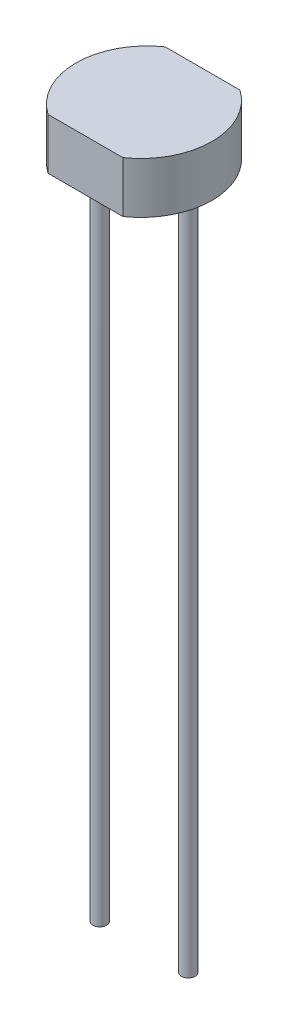
ISO-10303-21;
HEADER;
FILE_DESCRIPTION(('STEP AP214'),'2;1');
FILE_NAME('part.step','',(''),(''),'','','');
FILE_SCHEMA(('AUTOMOTIVE_DESIGN { 1 0 10303 214 1 1 1 1 }'));
ENDSEC;
DATA;
#1=APPLICATION_CONTEXT('core data for automotive mechanical design processes');
#2=APPLICATION_PROTOCOL_DEFINITION('international standard','automotive_design',2000,#1);
#3=PRODUCT_CONTEXT('',#1,'mechanical');
#4=PRODUCT('Part','Part','',(#3));
#5=PRODUCT_RELATED_PRODUCT_CATEGORY('part','',(#4));
#6=PRODUCT_DEFINITION_FORMATION('','',#4);
#7=PRODUCT_DEFINITION_CONTEXT('part definition',#1,'design');
#8=PRODUCT_DEFINITION('design','',#6,#7);
#9=PRODUCT_DEFINITION_SHAPE('','',#8);
#10=(LENGTH_UNIT() NAMED_UNIT(*) SI_UNIT(.MILLI.,.METRE.));
#11=(NAMED_UNIT(*) PLANE_ANGLE_UNIT() SI_UNIT($,.RADIAN.));
#12=(NAMED_UNIT(*) SI_UNIT($,.STERADIAN.) SOLID_ANGLE_UNIT());
#13=UNCERTAINTY_MEASURE_WITH_UNIT(LENGTH_MEASURE(1.E-05),#10,'distance_accuracy_value','');
#14=(GEOMETRIC_REPRESENTATION_CONTEXT(3) GLOBAL_UNCERTAINTY_ASSIGNED_CONTEXT((#13)) GLOBAL_UNIT_ASSIGNED_CONTEXT((#10,
#11,#12)) REPRESENTATION_CONTEXT('',''));
#15=CARTESIAN_POINT('',(0.,0.,0.));
#16=DIRECTION('',(0.,0.,1.));
#17=DIRECTION('',(1.,0.,0.));
#18=AXIS2_PLACEMENT_3D('',#15,#16,#17);
#19=CARTESIAN_POINT('',(0.118815555555555,1.905,0.));
#20=DIRECTION('',(0.,-1.,0.));
#21=DIRECTION('',(0.,0.,-1.));
#22=AXIS2_PLACEMENT_3D('',#19,#20,#21);
#23=CYLINDRICAL_SURFACE('',#22,2.65881555555556);
#24=CARTESIAN_POINT('',(0.118815555555555,0.,0.));
#25=DIRECTION('',(0.,1.,0.));
#26=DIRECTION('',(0.,0.,1.));
#27=AXIS2_PLACEMENT_3D('',#24,#25,#26);
#28=CIRCLE('',#27,2.65881555555556);
#29=CARTESIAN_POINT('',(-1.397,0.,-2.1844));
#30=VERTEX_POINT('',#29);
#31=CARTESIAN_POINT('',(-1.397,0.,2.1844));
#32=VERTEX_POINT('',#31);
#33=EDGE_CURVE('E111',#30,#32,#28,.T.);
#34=ORIENTED_EDGE('',*,*,#33,.T.);
#35=DIRECTION('',(0.,-1.,0.));
#36=VECTOR('',#35,1.);
#37=CARTESIAN_POINT('',(-1.397,1.905,2.1844));
#38=LINE('',#37,#36);
#39=CARTESIAN_POINT('',(-1.397,1.905,2.1844));
#40=VERTEX_POINT('',#39);
#41=EDGE_CURVE('E100',#40,#32,#38,.T.);
#42=ORIENTED_EDGE('',*,*,#41,.F.);
#43=CARTESIAN_POINT('',(0.118815555555555,1.905,0.));
#44=DIRECTION('',(0.,1.,0.));
#45=DIRECTION('',(0.,0.,1.));
#46=AXIS2_PLACEMENT_3D('',#43,#44,#45);
#47=CIRCLE('',#46,2.65881555555556);
#48=CARTESIAN_POINT('',(-1.397,1.905,-2.1844));
#49=VERTEX_POINT('',#48);
#50=EDGE_CURVE('E92',#49,#40,#47,.T.);
#51=ORIENTED_EDGE('',*,*,#50,.F.);
#52=DIRECTION('',(0.,-1.,0.));
#53=VECTOR('',#52,1.);
#54=CARTESIAN_POINT('',(-1.397,1.905,-2.1844));
#55=LINE('',#54,#53);
#56=EDGE_CURVE('E107',#49,#30,#55,.T.);
#57=ORIENTED_EDGE('',*,*,#56,.T.);
#58=EDGE_LOOP('',(#34,#42,#51,#57));
#59=FACE_BOUND('',#58,.T.);
#60=ADVANCED_FACE('F39',(#59),#23,.T.);
#61=CARTESIAN_POINT('',(-1.397,1.905,2.1844));
#62=DIRECTION('',(0.,0.,-1.));
#63=DIRECTION('',(-1.,0.,0.));
#64=AXIS2_PLACEMENT_3D('',#61,#62,#63);
#65=PLANE('',#64);
#66=DIRECTION('',(1.,0.,0.));
#67=VECTOR('',#66,1.);
#68=CARTESIAN_POINT('',(-1.397,0.,2.1844));
#69=LINE('',#68,#67);
#70=CARTESIAN_POINT('',(1.397,0.,2.1844));
#71=VERTEX_POINT('',#70);
#72=EDGE_CURVE('E98',#32,#71,#69,.T.);
#73=ORIENTED_EDGE('',*,*,#72,.T.);
#74=DIRECTION('',(0.,-1.,0.));
#75=VECTOR('',#74,1.);
#76=CARTESIAN_POINT('',(1.397,1.905,2.1844));
#77=LINE('',#76,#75);
#78=CARTESIAN_POINT('',(1.397,1.905,2.1844));
#79=VERTEX_POINT('',#78);
#80=EDGE_CURVE('E96',#79,#71,#77,.T.);
#81=ORIENTED_EDGE('',*,*,#80,.F.);
#82=DIRECTION('',(1.,0.,0.));
#83=VECTOR('',#82,1.);
#84=CARTESIAN_POINT('',(-1.397,1.905,2.1844));
#85=LINE('',#84,#83);
#86=EDGE_CURVE('E87',#40,#79,#85,.T.);
#87=ORIENTED_EDGE('',*,*,#86,.F.);
#88=ORIENTED_EDGE('',*,*,#41,.T.);
#89=EDGE_LOOP('',(#73,#81,#87,#88));
#90=FACE_BOUND('',#89,.T.);
#91=ADVANCED_FACE('F97',(#90),#65,.F.);
#92=CARTESIAN_POINT('',(-0.118815555555555,1.905,0.));
#93=DIRECTION('',(0.,-1.,0.));
#94=DIRECTION('',(0.,0.,-1.));
#95=AXIS2_PLACEMENT_3D('',#92,#93,#94);
#96=CYLINDRICAL_SURFACE('',#95,2.65881555555556);
#97=CARTESIAN_POINT('',(-0.118815555555555,0.,0.));
#98=DIRECTION('',(0.,1.,0.));
#99=DIRECTION('',(0.,0.,-1.));
#100=AXIS2_PLACEMENT_3D('',#97,#98,#99);
#101=CIRCLE('',#100,2.65881555555556);
#102=CARTESIAN_POINT('',(1.397,0.,-2.1844));
#103=VERTEX_POINT('',#102);
#104=EDGE_CURVE('E73',#71,#103,#101,.T.);
#105=ORIENTED_EDGE('',*,*,#104,.T.);
#106=DIRECTION('',(0.,-1.,0.));
#107=VECTOR('',#106,1.);
#108=CARTESIAN_POINT('',(1.397,1.905,-2.1844));
#109=LINE('',#108,#107);
#110=CARTESIAN_POINT('',(1.397,1.905,-2.1844));
#111=VERTEX_POINT('',#110);
#112=EDGE_CURVE('E101',#111,#103,#109,.T.);
#113=ORIENTED_EDGE('',*,*,#112,.F.);
#114=CARTESIAN_POINT('',(-0.118815555555555,1.905,0.));
#115=DIRECTION('',(0.,1.,0.));
#116=DIRECTION('',(0.,0.,-1.));
#117=AXIS2_PLACEMENT_3D('',#114,#115,#116);
#118=CIRCLE('',#117,2.65881555555556);
#119=EDGE_CURVE('E90',#79,#111,#118,.T.);
#120=ORIENTED_EDGE('',*,*,#119,.F.);
#121=ORIENTED_EDGE('',*,*,#80,.T.);
#122=EDGE_LOOP('',(#105,#113,#120,#121));
#123=FACE_BOUND('',#122,.T.);
#124=ADVANCED_FACE('F103',(#123),#96,.T.);
#125=CARTESIAN_POINT('',(-1.397,1.905,-2.1844));
#126=DIRECTION('',(0.,0.,1.));
#127=DIRECTION('',(1.,0.,0.));
#128=AXIS2_PLACEMENT_3D('',#125,#126,#127);
#129=PLANE('',#128);
#130=DIRECTION('',(-1.,0.,0.));
#131=VECTOR('',#130,1.);
#132=CARTESIAN_POINT('',(-1.397,0.,-2.1844));
#133=LINE('',#132,#131);
#134=EDGE_CURVE('E79',#103,#30,#133,.T.);
#135=ORIENTED_EDGE('',*,*,#134,.T.);
#136=ORIENTED_EDGE('',*,*,#56,.F.);
#137=DIRECTION('',(-1.,0.,0.));
#138=VECTOR('',#137,1.);
#139=CARTESIAN_POINT('',(-1.397,1.905,-2.1844));
#140=LINE('',#139,#138);
#141=EDGE_CURVE('E56',#111,#49,#140,.T.);
#142=ORIENTED_EDGE('',*,*,#141,.F.);
#143=ORIENTED_EDGE('',*,*,#112,.T.);
#144=EDGE_LOOP('',(#135,#136,#142,#143));
#145=FACE_BOUND('',#144,.T.);
#146=ADVANCED_FACE('F140',(#145),#129,.F.);
#147=CARTESIAN_POINT('',(0.118815555555555,1.905,0.));
#148=DIRECTION('',(0.,1.,0.));
#149=DIRECTION('',(0.,0.,1.));
#150=AXIS2_PLACEMENT_3D('',#147,#148,#149);
#151=PLANE('',#150);
#152=ORIENTED_EDGE('',*,*,#50,.T.);
#153=ORIENTED_EDGE('',*,*,#86,.T.);
#154=ORIENTED_EDGE('',*,*,#119,.T.);
#155=ORIENTED_EDGE('',*,*,#141,.T.);
#156=EDGE_LOOP('',(#152,#153,#154,#155));
#157=FACE_BOUND('',#156,.T.);
#158=ADVANCED_FACE('F88',(#157),#151,.T.);
#159=CARTESIAN_POINT('',(0.118815555555555,0.,0.));
#160=DIRECTION('',(0.,1.,0.));
#161=DIRECTION('',(0.,0.,1.));
#162=AXIS2_PLACEMENT_3D('',#159,#160,#161);
#163=PLANE('',#162);
#164=CARTESIAN_POINT('',(1.651,0.,0.));
#165=DIRECTION('',(0.,1.,0.));
#166=DIRECTION('',(0.,0.,1.));
#167=AXIS2_PLACEMENT_3D('',#164,#165,#166);
#168=CIRCLE('',#167,0.254);
#169=CARTESIAN_POINT('',(1.651,0.,0.254));
#170=VERTEX_POINT('',#169);
#171=EDGE_CURVE('E11',#170,#170,#168,.F.);
#172=ORIENTED_EDGE('',*,*,#171,.F.);
#173=EDGE_LOOP('',(#172));
#174=FACE_BOUND('',#173,.T.);
#175=CARTESIAN_POINT('',(-1.651,0.,0.));
#176=DIRECTION('',(0.,1.,0.));
#177=DIRECTION('',(0.,0.,1.));
#178=AXIS2_PLACEMENT_3D('',#175,#176,#177);
#179=CIRCLE('',#178,0.254);
#180=CARTESIAN_POINT('',(-1.651,0.,0.254));
#181=VERTEX_POINT('',#180);
#182=EDGE_CURVE('E48',#181,#181,#179,.F.);
#183=ORIENTED_EDGE('',*,*,#182,.F.);
#184=EDGE_LOOP('',(#183));
#185=FACE_BOUND('',#184,.T.);
#186=ORIENTED_EDGE('',*,*,#33,.F.);
#187=ORIENTED_EDGE('',*,*,#134,.F.);
#188=ORIENTED_EDGE('',*,*,#104,.F.);
#189=ORIENTED_EDGE('',*,*,#72,.F.);
#190=EDGE_LOOP('',(#186,#187,#188,#189));
#191=FACE_BOUND('',#190,.T.);
#192=ADVANCED_FACE('F133',(#174,#185,#191),#163,.F.);
#193=CARTESIAN_POINT('',(-1.651,-25.4,0.));
#194=DIRECTION('',(0.,1.,0.));
#195=DIRECTION('',(0.,0.,1.));
#196=AXIS2_PLACEMENT_3D('',#193,#194,#195);
#197=CYLINDRICAL_SURFACE('',#196,0.254);
#198=CARTESIAN_POINT('',(-1.651,-25.4,0.));
#199=DIRECTION('',(0.,-1.,0.));
#200=DIRECTION('',(0.,0.,-1.));
#201=AXIS2_PLACEMENT_3D('',#198,#199,#200);
#202=CIRCLE('',#201,0.254);
#203=CARTESIAN_POINT('',(-1.651,-25.4,-0.254));
#204=VERTEX_POINT('',#203);
#205=EDGE_CURVE('E115',#204,#204,#202,.T.);
#206=ORIENTED_EDGE('',*,*,#205,.F.);
#207=EDGE_LOOP('',(#206));
#208=FACE_BOUND('',#207,.T.);
#209=ORIENTED_EDGE('',*,*,#182,.T.);
#210=EDGE_LOOP('',(#209));
#211=FACE_BOUND('',#210,.T.);
#212=ADVANCED_FACE('F131',(#208,#211),#197,.T.);
#213=CARTESIAN_POINT('',(-1.651,-25.4,0.));
#214=DIRECTION('',(0.,-1.,0.));
#215=DIRECTION('',(0.,0.,-1.));
#216=AXIS2_PLACEMENT_3D('',#213,#214,#215);
#217=PLANE('',#216);
#218=ORIENTED_EDGE('',*,*,#205,.T.);
#219=EDGE_LOOP('',(#218));
#220=FACE_BOUND('',#219,.T.);
#221=ADVANCED_FACE('F184',(#220),#217,.T.);
#222=CARTESIAN_POINT('',(1.651,-25.4,0.));
#223=DIRECTION('',(0.,1.,0.));
#224=DIRECTION('',(0.,0.,1.));
#225=AXIS2_PLACEMENT_3D('',#222,#223,#224);
#226=CYLINDRICAL_SURFACE('',#225,0.254);
#227=CARTESIAN_POINT('',(1.651,-25.4,0.));
#228=DIRECTION('',(0.,-1.,0.));
#229=DIRECTION('',(0.,0.,1.));
#230=AXIS2_PLACEMENT_3D('',#227,#228,#229);
#231=CIRCLE('',#230,0.254);
#232=CARTESIAN_POINT('',(1.651,-25.4,0.254));
#233=VERTEX_POINT('',#232);
#234=EDGE_CURVE('E220',#233,#233,#231,.T.);
#235=ORIENTED_EDGE('',*,*,#234,.F.);
#236=EDGE_LOOP('',(#235));
#237=FACE_BOUND('',#236,.T.);
#238=ORIENTED_EDGE('',*,*,#171,.T.);
#239=EDGE_LOOP('',(#238));
#240=FACE_BOUND('',#239,.T.);
#241=ADVANCED_FACE('F194',(#237,#240),#226,.T.);
#242=CARTESIAN_POINT('',(1.651,-25.4,0.));
#243=DIRECTION('',(0.,1.,0.));
#244=DIRECTION('',(0.,0.,1.));
#245=AXIS2_PLACEMENT_3D('',#242,#243,#244);
#246=PLANE('',#245);
#247=ORIENTED_EDGE('',*,*,#234,.T.);
#248=EDGE_LOOP('',(#247));
#249=FACE_BOUND('',#248,.T.);
#250=ADVANCED_FACE('F204',(#249),#246,.F.);
#251=CLOSED_SHELL('',(#60,#91,#124,#146,#158,#192,#212,#221,#241,#250));
#252=MANIFOLD_SOLID_BREP('B2',#251);
#253=ADVANCED_BREP_SHAPE_REPRESENTATION('',(#18,#252),#14);
#254=SHAPE_DEFINITION_REPRESENTATION(#9,#253);
ENDSEC;
END-ISO-10303-21;
